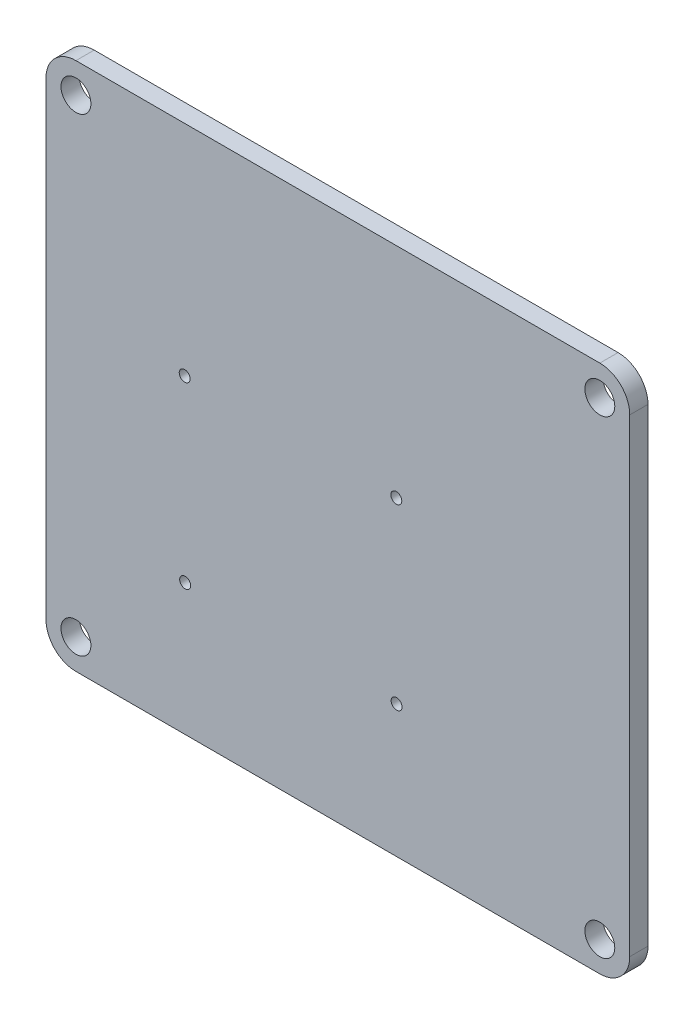
ISO-10303-21;
HEADER;
FILE_DESCRIPTION(('STEP AP214'),'2;1');
FILE_NAME('part.step','',(''),(''),'','','');
FILE_SCHEMA(('AUTOMOTIVE_DESIGN { 1 0 10303 214 1 1 1 1 }'));
ENDSEC;
DATA;
#1=APPLICATION_CONTEXT('core data for automotive mechanical design processes');
#2=APPLICATION_PROTOCOL_DEFINITION('international standard','automotive_design',2000,#1);
#3=PRODUCT_CONTEXT('',#1,'mechanical');
#4=PRODUCT('Part','Part','',(#3));
#5=PRODUCT_RELATED_PRODUCT_CATEGORY('part','',(#4));
#6=PRODUCT_DEFINITION_FORMATION('','',#4);
#7=PRODUCT_DEFINITION_CONTEXT('part definition',#1,'design');
#8=PRODUCT_DEFINITION('design','',#6,#7);
#9=PRODUCT_DEFINITION_SHAPE('','',#8);
#10=(LENGTH_UNIT() NAMED_UNIT(*) SI_UNIT(.MILLI.,.METRE.));
#11=(NAMED_UNIT(*) PLANE_ANGLE_UNIT() SI_UNIT($,.RADIAN.));
#12=(NAMED_UNIT(*) SI_UNIT($,.STERADIAN.) SOLID_ANGLE_UNIT());
#13=UNCERTAINTY_MEASURE_WITH_UNIT(LENGTH_MEASURE(1.E-05),#10,'distance_accuracy_value','');
#14=(GEOMETRIC_REPRESENTATION_CONTEXT(3) GLOBAL_UNCERTAINTY_ASSIGNED_CONTEXT((#13)) GLOBAL_UNIT_ASSIGNED_CONTEXT((#10,
#11,#12)) REPRESENTATION_CONTEXT('',''));
#15=CARTESIAN_POINT('',(0.,0.,0.));
#16=DIRECTION('',(0.,0.,1.));
#17=DIRECTION('',(1.,0.,0.));
#18=AXIS2_PLACEMENT_3D('',#15,#16,#17);
#19=CARTESIAN_POINT('',(-71.8,-64.3,5.));
#20=DIRECTION('',(0.,0.,-1.));
#21=DIRECTION('',(-1.,0.,0.));
#22=AXIS2_PLACEMENT_3D('',#19,#20,#21);
#23=CYLINDRICAL_SURFACE('',#22,8.19999999999999);
#24=CARTESIAN_POINT('',(-71.8,-64.3,0.));
#25=DIRECTION('',(0.,0.,1.));
#26=DIRECTION('',(1.,0.,0.));
#27=AXIS2_PLACEMENT_3D('',#24,#25,#26);
#28=CIRCLE('',#27,8.19999999999999);
#29=CARTESIAN_POINT('',(-71.8,-72.5,0.));
#30=VERTEX_POINT('',#29);
#31=CARTESIAN_POINT('',(-80.,-64.3,0.));
#32=VERTEX_POINT('',#31);
#33=EDGE_CURVE('E149',#30,#32,#28,.F.);
#34=ORIENTED_EDGE('',*,*,#33,.F.);
#35=DIRECTION('',(0.,0.,-1.));
#36=VECTOR('',#35,1.);
#37=CARTESIAN_POINT('',(-71.8,-72.5,5.));
#38=LINE('',#37,#36);
#39=CARTESIAN_POINT('',(-71.8,-72.5,5.));
#40=VERTEX_POINT('',#39);
#41=EDGE_CURVE('E11',#40,#30,#38,.T.);
#42=ORIENTED_EDGE('',*,*,#41,.F.);
#43=CARTESIAN_POINT('',(-71.8,-64.3,5.));
#44=DIRECTION('',(0.,0.,1.));
#45=DIRECTION('',(1.,0.,0.));
#46=AXIS2_PLACEMENT_3D('',#43,#44,#45);
#47=CIRCLE('',#46,8.19999999999999);
#48=CARTESIAN_POINT('',(-80.,-64.3,5.));
#49=VERTEX_POINT('',#48);
#50=EDGE_CURVE('E284',#40,#49,#47,.F.);
#51=ORIENTED_EDGE('',*,*,#50,.T.);
#52=DIRECTION('',(0.,0.,-1.));
#53=VECTOR('',#52,1.);
#54=CARTESIAN_POINT('',(-80.,-64.3,5.));
#55=LINE('',#54,#53);
#56=EDGE_CURVE('E58',#49,#32,#55,.T.);
#57=ORIENTED_EDGE('',*,*,#56,.T.);
#58=EDGE_LOOP('',(#34,#42,#51,#57));
#59=FACE_BOUND('',#58,.T.);
#60=ADVANCED_FACE('F41',(#59),#23,.T.);
#61=CARTESIAN_POINT('',(0.,-72.5,5.));
#62=DIRECTION('',(0.,-1.,0.));
#63=DIRECTION('',(0.,0.,-1.));
#64=AXIS2_PLACEMENT_3D('',#61,#62,#63);
#65=PLANE('',#64);
#66=DIRECTION('',(-1.,0.,0.));
#67=VECTOR('',#66,1.);
#68=CARTESIAN_POINT('',(0.,-72.5,0.));
#69=LINE('',#68,#67);
#70=CARTESIAN_POINT('',(71.8,-72.5,0.));
#71=VERTEX_POINT('',#70);
#72=EDGE_CURVE('E148',#71,#30,#69,.T.);
#73=ORIENTED_EDGE('',*,*,#72,.F.);
#74=DIRECTION('',(0.,0.,-1.));
#75=VECTOR('',#74,1.);
#76=CARTESIAN_POINT('',(71.8,-72.5,5.));
#77=LINE('',#76,#75);
#78=CARTESIAN_POINT('',(71.8,-72.5,5.));
#79=VERTEX_POINT('',#78);
#80=EDGE_CURVE('E51',#79,#71,#77,.T.);
#81=ORIENTED_EDGE('',*,*,#80,.F.);
#82=DIRECTION('',(-1.,0.,0.));
#83=VECTOR('',#82,1.);
#84=CARTESIAN_POINT('',(0.,-72.5,5.));
#85=LINE('',#84,#83);
#86=EDGE_CURVE('E282',#79,#40,#85,.T.);
#87=ORIENTED_EDGE('',*,*,#86,.T.);
#88=ORIENTED_EDGE('',*,*,#41,.T.);
#89=EDGE_LOOP('',(#73,#81,#87,#88));
#90=FACE_BOUND('',#89,.T.);
#91=ADVANCED_FACE('F210',(#90),#65,.T.);
#92=CARTESIAN_POINT('',(71.8,-64.3,5.));
#93=DIRECTION('',(0.,0.,-1.));
#94=DIRECTION('',(-1.,0.,0.));
#95=AXIS2_PLACEMENT_3D('',#92,#93,#94);
#96=CYLINDRICAL_SURFACE('',#95,8.19999999999999);
#97=CARTESIAN_POINT('',(71.8,-64.3,0.));
#98=DIRECTION('',(0.,0.,1.));
#99=DIRECTION('',(1.,0.,0.));
#100=AXIS2_PLACEMENT_3D('',#97,#98,#99);
#101=CIRCLE('',#100,8.19999999999999);
#102=CARTESIAN_POINT('',(80.,-64.3,0.));
#103=VERTEX_POINT('',#102);
#104=EDGE_CURVE('E154',#103,#71,#101,.F.);
#105=ORIENTED_EDGE('',*,*,#104,.F.);
#106=DIRECTION('',(0.,0.,-1.));
#107=VECTOR('',#106,1.);
#108=CARTESIAN_POINT('',(80.,-64.3,5.));
#109=LINE('',#108,#107);
#110=CARTESIAN_POINT('',(80.,-64.3,5.));
#111=VERTEX_POINT('',#110);
#112=EDGE_CURVE('E174',#111,#103,#109,.T.);
#113=ORIENTED_EDGE('',*,*,#112,.F.);
#114=CARTESIAN_POINT('',(71.8,-64.3,5.));
#115=DIRECTION('',(0.,0.,1.));
#116=DIRECTION('',(1.,0.,0.));
#117=AXIS2_PLACEMENT_3D('',#114,#115,#116);
#118=CIRCLE('',#117,8.19999999999999);
#119=EDGE_CURVE('E280',#111,#79,#118,.F.);
#120=ORIENTED_EDGE('',*,*,#119,.T.);
#121=ORIENTED_EDGE('',*,*,#80,.T.);
#122=EDGE_LOOP('',(#105,#113,#120,#121));
#123=FACE_BOUND('',#122,.T.);
#124=ADVANCED_FACE('F215',(#123),#96,.T.);
#125=CARTESIAN_POINT('',(80.,0.,5.));
#126=DIRECTION('',(-1.,0.,0.));
#127=DIRECTION('',(0.,0.,1.));
#128=AXIS2_PLACEMENT_3D('',#125,#126,#127);
#129=PLANE('',#128);
#130=DIRECTION('',(0.,1.,0.));
#131=VECTOR('',#130,1.);
#132=CARTESIAN_POINT('',(80.,0.,0.));
#133=LINE('',#132,#131);
#134=CARTESIAN_POINT('',(80.,64.3,0.));
#135=VERTEX_POINT('',#134);
#136=EDGE_CURVE('E157',#103,#135,#133,.T.);
#137=ORIENTED_EDGE('',*,*,#136,.T.);
#138=DIRECTION('',(0.,0.,-1.));
#139=VECTOR('',#138,1.);
#140=CARTESIAN_POINT('',(80.,64.3,5.));
#141=LINE('',#140,#139);
#142=CARTESIAN_POINT('',(80.,64.3,5.));
#143=VERTEX_POINT('',#142);
#144=EDGE_CURVE('E175',#143,#135,#141,.T.);
#145=ORIENTED_EDGE('',*,*,#144,.F.);
#146=DIRECTION('',(0.,1.,0.));
#147=VECTOR('',#146,1.);
#148=CARTESIAN_POINT('',(80.,0.,5.));
#149=LINE('',#148,#147);
#150=EDGE_CURVE('E273',#111,#143,#149,.T.);
#151=ORIENTED_EDGE('',*,*,#150,.F.);
#152=ORIENTED_EDGE('',*,*,#112,.T.);
#153=EDGE_LOOP('',(#137,#145,#151,#152));
#154=FACE_BOUND('',#153,.T.);
#155=ADVANCED_FACE('F265',(#154),#129,.F.);
#156=CARTESIAN_POINT('',(71.8,64.3,5.));
#157=DIRECTION('',(0.,0.,-1.));
#158=DIRECTION('',(-1.,0.,0.));
#159=AXIS2_PLACEMENT_3D('',#156,#157,#158);
#160=CYLINDRICAL_SURFACE('',#159,8.19999999999999);
#161=CARTESIAN_POINT('',(71.8,64.3,0.));
#162=DIRECTION('',(0.,0.,1.));
#163=DIRECTION('',(1.,0.,0.));
#164=AXIS2_PLACEMENT_3D('',#161,#162,#163);
#165=CIRCLE('',#164,8.19999999999999);
#166=CARTESIAN_POINT('',(71.8,72.5,0.));
#167=VERTEX_POINT('',#166);
#168=EDGE_CURVE('E156',#135,#167,#165,.T.);
#169=ORIENTED_EDGE('',*,*,#168,.T.);
#170=DIRECTION('',(0.,0.,-1.));
#171=VECTOR('',#170,1.);
#172=CARTESIAN_POINT('',(71.8,72.5,5.));
#173=LINE('',#172,#171);
#174=CARTESIAN_POINT('',(71.8,72.5,5.));
#175=VERTEX_POINT('',#174);
#176=EDGE_CURVE('E129',#175,#167,#173,.T.);
#177=ORIENTED_EDGE('',*,*,#176,.F.);
#178=CARTESIAN_POINT('',(71.8,64.3,5.));
#179=DIRECTION('',(0.,0.,1.));
#180=DIRECTION('',(1.,0.,0.));
#181=AXIS2_PLACEMENT_3D('',#178,#179,#180);
#182=CIRCLE('',#181,8.19999999999999);
#183=EDGE_CURVE('E120',#143,#175,#182,.T.);
#184=ORIENTED_EDGE('',*,*,#183,.F.);
#185=ORIENTED_EDGE('',*,*,#144,.T.);
#186=EDGE_LOOP('',(#169,#177,#184,#185));
#187=FACE_BOUND('',#186,.T.);
#188=ADVANCED_FACE('F256',(#187),#160,.T.);
#189=CARTESIAN_POINT('',(0.,72.5,5.));
#190=DIRECTION('',(0.,-1.,0.));
#191=DIRECTION('',(0.,0.,-1.));
#192=AXIS2_PLACEMENT_3D('',#189,#190,#191);
#193=PLANE('',#192);
#194=DIRECTION('',(-1.,0.,0.));
#195=VECTOR('',#194,1.);
#196=CARTESIAN_POINT('',(0.,72.5,0.));
#197=LINE('',#196,#195);
#198=CARTESIAN_POINT('',(-71.8,72.5,0.));
#199=VERTEX_POINT('',#198);
#200=EDGE_CURVE('E123',#167,#199,#197,.T.);
#201=ORIENTED_EDGE('',*,*,#200,.T.);
#202=DIRECTION('',(0.,0.,-1.));
#203=VECTOR('',#202,1.);
#204=CARTESIAN_POINT('',(-71.8,72.5,5.));
#205=LINE('',#204,#203);
#206=CARTESIAN_POINT('',(-71.8,72.5,5.));
#207=VERTEX_POINT('',#206);
#208=EDGE_CURVE('E124',#207,#199,#205,.T.);
#209=ORIENTED_EDGE('',*,*,#208,.F.);
#210=DIRECTION('',(-1.,0.,0.));
#211=VECTOR('',#210,1.);
#212=CARTESIAN_POINT('',(0.,72.5,5.));
#213=LINE('',#212,#211);
#214=EDGE_CURVE('E109',#175,#207,#213,.T.);
#215=ORIENTED_EDGE('',*,*,#214,.F.);
#216=ORIENTED_EDGE('',*,*,#176,.T.);
#217=EDGE_LOOP('',(#201,#209,#215,#216));
#218=FACE_BOUND('',#217,.T.);
#219=ADVANCED_FACE('F121',(#218),#193,.F.);
#220=CARTESIAN_POINT('',(-71.8,64.3,5.));
#221=DIRECTION('',(0.,0.,-1.));
#222=DIRECTION('',(-1.,0.,0.));
#223=AXIS2_PLACEMENT_3D('',#220,#221,#222);
#224=CYLINDRICAL_SURFACE('',#223,8.19999999999999);
#225=CARTESIAN_POINT('',(-71.8,64.3,0.));
#226=DIRECTION('',(0.,0.,1.));
#227=DIRECTION('',(1.,0.,0.));
#228=AXIS2_PLACEMENT_3D('',#225,#226,#227);
#229=CIRCLE('',#228,8.19999999999999);
#230=CARTESIAN_POINT('',(-80.,64.3,0.));
#231=VERTEX_POINT('',#230);
#232=EDGE_CURVE('E161',#231,#199,#229,.F.);
#233=ORIENTED_EDGE('',*,*,#232,.F.);
#234=DIRECTION('',(0.,0.,-1.));
#235=VECTOR('',#234,1.);
#236=CARTESIAN_POINT('',(-80.,64.3,5.));
#237=LINE('',#236,#235);
#238=CARTESIAN_POINT('',(-80.,64.3,5.));
#239=VERTEX_POINT('',#238);
#240=EDGE_CURVE('E83',#239,#231,#237,.T.);
#241=ORIENTED_EDGE('',*,*,#240,.F.);
#242=CARTESIAN_POINT('',(-71.8,64.3,5.));
#243=DIRECTION('',(0.,0.,1.));
#244=DIRECTION('',(1.,0.,0.));
#245=AXIS2_PLACEMENT_3D('',#242,#243,#244);
#246=CIRCLE('',#245,8.19999999999999);
#247=EDGE_CURVE('E114',#239,#207,#246,.F.);
#248=ORIENTED_EDGE('',*,*,#247,.T.);
#249=ORIENTED_EDGE('',*,*,#208,.T.);
#250=EDGE_LOOP('',(#233,#241,#248,#249));
#251=FACE_BOUND('',#250,.T.);
#252=ADVANCED_FACE('F128',(#251),#224,.T.);
#253=CARTESIAN_POINT('',(-71.8,-64.3,5.));
#254=DIRECTION('',(0.,0.,-1.));
#255=DIRECTION('',(-1.,0.,0.));
#256=AXIS2_PLACEMENT_3D('',#253,#254,#255);
#257=CYLINDRICAL_SURFACE('',#256,4.1);
#258=CARTESIAN_POINT('',(-71.8,-64.3,5.));
#259=DIRECTION('',(0.,0.,1.));
#260=DIRECTION('',(1.,0.,0.));
#261=AXIS2_PLACEMENT_3D('',#258,#259,#260);
#262=CIRCLE('',#261,4.1);
#263=CARTESIAN_POINT('',(-67.7,-64.3,5.));
#264=VERTEX_POINT('',#263);
#265=EDGE_CURVE('E290',#264,#264,#262,.T.);
#266=ORIENTED_EDGE('',*,*,#265,.T.);
#267=EDGE_LOOP('',(#266));
#268=FACE_BOUND('',#267,.T.);
#269=CARTESIAN_POINT('',(-71.8,-64.3,0.));
#270=DIRECTION('',(0.,0.,1.));
#271=DIRECTION('',(1.,0.,0.));
#272=AXIS2_PLACEMENT_3D('',#269,#270,#271);
#273=CIRCLE('',#272,4.1);
#274=CARTESIAN_POINT('',(-67.7,-64.3,0.));
#275=VERTEX_POINT('',#274);
#276=EDGE_CURVE('E143',#275,#275,#273,.T.);
#277=ORIENTED_EDGE('',*,*,#276,.F.);
#278=EDGE_LOOP('',(#277));
#279=FACE_BOUND('',#278,.T.);
#280=ADVANCED_FACE('F220',(#268,#279),#257,.F.);
#281=CARTESIAN_POINT('',(-71.8,64.3,5.));
#282=DIRECTION('',(0.,0.,-1.));
#283=DIRECTION('',(-1.,0.,0.));
#284=AXIS2_PLACEMENT_3D('',#281,#282,#283);
#285=CYLINDRICAL_SURFACE('',#284,4.1);
#286=CARTESIAN_POINT('',(-71.8,64.3,5.));
#287=DIRECTION('',(0.,0.,1.));
#288=DIRECTION('',(1.,0.,0.));
#289=AXIS2_PLACEMENT_3D('',#286,#287,#288);
#290=CIRCLE('',#289,4.1);
#291=CARTESIAN_POINT('',(-67.7,64.3,5.));
#292=VERTEX_POINT('',#291);
#293=EDGE_CURVE('E288',#292,#292,#290,.T.);
#294=ORIENTED_EDGE('',*,*,#293,.T.);
#295=EDGE_LOOP('',(#294));
#296=FACE_BOUND('',#295,.T.);
#297=CARTESIAN_POINT('',(-71.8,64.3,0.));
#298=DIRECTION('',(0.,0.,1.));
#299=DIRECTION('',(1.,0.,0.));
#300=AXIS2_PLACEMENT_3D('',#297,#298,#299);
#301=CIRCLE('',#300,4.1);
#302=CARTESIAN_POINT('',(-67.7,64.3,0.));
#303=VERTEX_POINT('',#302);
#304=EDGE_CURVE('E145',#303,#303,#301,.T.);
#305=ORIENTED_EDGE('',*,*,#304,.F.);
#306=EDGE_LOOP('',(#305));
#307=FACE_BOUND('',#306,.T.);
#308=ADVANCED_FACE('F218',(#296,#307),#285,.F.);
#309=CARTESIAN_POINT('',(71.8,64.3,5.));
#310=DIRECTION('',(0.,0.,-1.));
#311=DIRECTION('',(-1.,0.,0.));
#312=AXIS2_PLACEMENT_3D('',#309,#310,#311);
#313=CYLINDRICAL_SURFACE('',#312,4.1);
#314=CARTESIAN_POINT('',(71.8,64.3,5.));
#315=DIRECTION('',(0.,0.,1.));
#316=DIRECTION('',(1.,0.,0.));
#317=AXIS2_PLACEMENT_3D('',#314,#315,#316);
#318=CIRCLE('',#317,4.1);
#319=CARTESIAN_POINT('',(75.9,64.3,5.));
#320=VERTEX_POINT('',#319);
#321=EDGE_CURVE('E232',#320,#320,#318,.T.);
#322=ORIENTED_EDGE('',*,*,#321,.T.);
#323=EDGE_LOOP('',(#322));
#324=FACE_BOUND('',#323,.T.);
#325=CARTESIAN_POINT('',(71.8,64.3,0.));
#326=DIRECTION('',(0.,0.,1.));
#327=DIRECTION('',(1.,0.,0.));
#328=AXIS2_PLACEMENT_3D('',#325,#326,#327);
#329=CIRCLE('',#328,4.1);
#330=CARTESIAN_POINT('',(75.9,64.3,0.));
#331=VERTEX_POINT('',#330);
#332=EDGE_CURVE('E136',#331,#331,#329,.T.);
#333=ORIENTED_EDGE('',*,*,#332,.F.);
#334=EDGE_LOOP('',(#333));
#335=FACE_BOUND('',#334,.T.);
#336=ADVANCED_FACE('F224',(#324,#335),#313,.F.);
#337=CARTESIAN_POINT('',(71.8,-64.3,5.));
#338=DIRECTION('',(0.,0.,-1.));
#339=DIRECTION('',(-1.,0.,0.));
#340=AXIS2_PLACEMENT_3D('',#337,#338,#339);
#341=CYLINDRICAL_SURFACE('',#340,4.1);
#342=CARTESIAN_POINT('',(71.8,-64.3,5.));
#343=DIRECTION('',(0.,0.,1.));
#344=DIRECTION('',(1.,0.,0.));
#345=AXIS2_PLACEMENT_3D('',#342,#343,#344);
#346=CIRCLE('',#345,4.1);
#347=CARTESIAN_POINT('',(75.9,-64.3,5.));
#348=VERTEX_POINT('',#347);
#349=EDGE_CURVE('E166',#348,#348,#346,.T.);
#350=ORIENTED_EDGE('',*,*,#349,.T.);
#351=EDGE_LOOP('',(#350));
#352=FACE_BOUND('',#351,.T.);
#353=CARTESIAN_POINT('',(71.8,-64.3,0.));
#354=DIRECTION('',(0.,0.,1.));
#355=DIRECTION('',(1.,0.,0.));
#356=AXIS2_PLACEMENT_3D('',#353,#354,#355);
#357=CIRCLE('',#356,4.1);
#358=CARTESIAN_POINT('',(75.9,-64.3,0.));
#359=VERTEX_POINT('',#358);
#360=EDGE_CURVE('E137',#359,#359,#357,.T.);
#361=ORIENTED_EDGE('',*,*,#360,.F.);
#362=EDGE_LOOP('',(#361));
#363=FACE_BOUND('',#362,.T.);
#364=ADVANCED_FACE('F43',(#352,#363),#341,.F.);
#365=CARTESIAN_POINT('',(-80.,0.,5.));
#366=DIRECTION('',(-1.,0.,0.));
#367=DIRECTION('',(0.,0.,1.));
#368=AXIS2_PLACEMENT_3D('',#365,#366,#367);
#369=PLANE('',#368);
#370=DIRECTION('',(0.,1.,0.));
#371=VECTOR('',#370,1.);
#372=CARTESIAN_POINT('',(-80.,0.,0.));
#373=LINE('',#372,#371);
#374=EDGE_CURVE('E164',#32,#231,#373,.T.);
#375=ORIENTED_EDGE('',*,*,#374,.F.);
#376=ORIENTED_EDGE('',*,*,#56,.F.);
#377=DIRECTION('',(0.,1.,0.));
#378=VECTOR('',#377,1.);
#379=CARTESIAN_POINT('',(-80.,0.,5.));
#380=LINE('',#379,#378);
#381=EDGE_CURVE('E132',#49,#239,#380,.T.);
#382=ORIENTED_EDGE('',*,*,#381,.T.);
#383=ORIENTED_EDGE('',*,*,#240,.T.);
#384=EDGE_LOOP('',(#375,#376,#382,#383));
#385=FACE_BOUND('',#384,.T.);
#386=ADVANCED_FACE('F229',(#385),#369,.T.);
#387=CARTESIAN_POINT('',(0.,0.,5.));
#388=DIRECTION('',(0.,0.,1.));
#389=DIRECTION('',(1.,0.,0.));
#390=AXIS2_PLACEMENT_3D('',#387,#388,#389);
#391=PLANE('',#390);
#392=CARTESIAN_POINT('',(-41.863805611608,-36.4266556526666,5.));
#393=DIRECTION('',(0.,0.,1.));
#394=DIRECTION('',(1.,0.,0.));
#395=AXIS2_PLACEMENT_3D('',#392,#393,#394);
#396=CIRCLE('',#395,1.5);
#397=CARTESIAN_POINT('',(-40.363805611608,-36.4266556526666,5.));
#398=VERTEX_POINT('',#397);
#399=EDGE_CURVE('E299',#398,#398,#396,.T.);
#400=ORIENTED_EDGE('',*,*,#399,.F.);
#401=EDGE_LOOP('',(#400));
#402=FACE_BOUND('',#401,.T.);
#403=CARTESIAN_POINT('',(16.0858742720141,-36.2415182747968,5.));
#404=DIRECTION('',(0.,0.,1.));
#405=DIRECTION('',(1.,0.,0.));
#406=AXIS2_PLACEMENT_3D('',#403,#404,#405);
#407=CIRCLE('',#406,1.5);
#408=CARTESIAN_POINT('',(17.5858742720141,-36.2415182747968,5.));
#409=VERTEX_POINT('',#408);
#410=EDGE_CURVE('E301',#409,#409,#407,.T.);
#411=ORIENTED_EDGE('',*,*,#410,.F.);
#412=EDGE_LOOP('',(#411));
#413=FACE_BOUND('',#412,.T.);
#414=CARTESIAN_POINT('',(16.0134378967766,12.6184993730969,5.));
#415=DIRECTION('',(0.,0.,1.));
#416=DIRECTION('',(1.,0.,0.));
#417=AXIS2_PLACEMENT_3D('',#414,#415,#416);
#418=CIRCLE('',#417,1.5);
#419=CARTESIAN_POINT('',(17.5134378967766,12.6184993730969,5.));
#420=VERTEX_POINT('',#419);
#421=EDGE_CURVE('E296',#420,#420,#418,.T.);
#422=ORIENTED_EDGE('',*,*,#421,.F.);
#423=EDGE_LOOP('',(#422));
#424=FACE_BOUND('',#423,.T.);
#425=CARTESIAN_POINT('',(-41.9866307440674,12.5731904081818,5.));
#426=DIRECTION('',(0.,0.,1.));
#427=DIRECTION('',(1.,0.,0.));
#428=AXIS2_PLACEMENT_3D('',#425,#426,#427);
#429=CIRCLE('',#428,1.5);
#430=CARTESIAN_POINT('',(-40.4866307440674,12.5731904081818,5.));
#431=VERTEX_POINT('',#430);
#432=EDGE_CURVE('E185',#431,#431,#429,.T.);
#433=ORIENTED_EDGE('',*,*,#432,.F.);
#434=EDGE_LOOP('',(#433));
#435=FACE_BOUND('',#434,.T.);
#436=ORIENTED_EDGE('',*,*,#349,.F.);
#437=EDGE_LOOP('',(#436));
#438=FACE_BOUND('',#437,.T.);
#439=ORIENTED_EDGE('',*,*,#321,.F.);
#440=EDGE_LOOP('',(#439));
#441=FACE_BOUND('',#440,.T.);
#442=ORIENTED_EDGE('',*,*,#293,.F.);
#443=EDGE_LOOP('',(#442));
#444=FACE_BOUND('',#443,.T.);
#445=ORIENTED_EDGE('',*,*,#265,.F.);
#446=EDGE_LOOP('',(#445));
#447=FACE_BOUND('',#446,.T.);
#448=ORIENTED_EDGE('',*,*,#50,.F.);
#449=ORIENTED_EDGE('',*,*,#86,.F.);
#450=ORIENTED_EDGE('',*,*,#119,.F.);
#451=ORIENTED_EDGE('',*,*,#150,.T.);
#452=ORIENTED_EDGE('',*,*,#183,.T.);
#453=ORIENTED_EDGE('',*,*,#214,.T.);
#454=ORIENTED_EDGE('',*,*,#247,.F.);
#455=ORIENTED_EDGE('',*,*,#381,.F.);
#456=EDGE_LOOP('',(#448,#449,#450,#451,#452,#453,#454,#455));
#457=FACE_BOUND('',#456,.T.);
#458=ADVANCED_FACE('F115',(#402,#413,#424,#435,#438,#441,#444,#447,#457),#391,.T.);
#459=CARTESIAN_POINT('',(0.,0.,0.));
#460=DIRECTION('',(0.,0.,1.));
#461=DIRECTION('',(1.,0.,0.));
#462=AXIS2_PLACEMENT_3D('',#459,#460,#461);
#463=PLANE('',#462);
#464=CARTESIAN_POINT('',(-41.863805611608,-36.4266556526666,0.));
#465=DIRECTION('',(0.,0.,1.));
#466=DIRECTION('',(1.,0.,0.));
#467=AXIS2_PLACEMENT_3D('',#464,#465,#466);
#468=CIRCLE('',#467,1.5);
#469=CARTESIAN_POINT('',(-40.363805611608,-36.4266556526666,0.));
#470=VERTEX_POINT('',#469);
#471=EDGE_CURVE('E44',#470,#470,#468,.T.);
#472=ORIENTED_EDGE('',*,*,#471,.T.);
#473=EDGE_LOOP('',(#472));
#474=FACE_BOUND('',#473,.T.);
#475=CARTESIAN_POINT('',(16.0858742720141,-36.2415182747968,0.));
#476=DIRECTION('',(0.,0.,1.));
#477=DIRECTION('',(1.,0.,0.));
#478=AXIS2_PLACEMENT_3D('',#475,#476,#477);
#479=CIRCLE('',#478,1.5);
#480=CARTESIAN_POINT('',(17.5858742720141,-36.2415182747968,0.));
#481=VERTEX_POINT('',#480);
#482=EDGE_CURVE('E183',#481,#481,#479,.T.);
#483=ORIENTED_EDGE('',*,*,#482,.T.);
#484=EDGE_LOOP('',(#483));
#485=FACE_BOUND('',#484,.T.);
#486=CARTESIAN_POINT('',(16.0134378967766,12.6184993730969,0.));
#487=DIRECTION('',(0.,0.,1.));
#488=DIRECTION('',(1.,0.,0.));
#489=AXIS2_PLACEMENT_3D('',#486,#487,#488);
#490=CIRCLE('',#489,1.5);
#491=CARTESIAN_POINT('',(17.5134378967766,12.6184993730969,0.));
#492=VERTEX_POINT('',#491);
#493=EDGE_CURVE('E181',#492,#492,#490,.T.);
#494=ORIENTED_EDGE('',*,*,#493,.T.);
#495=EDGE_LOOP('',(#494));
#496=FACE_BOUND('',#495,.T.);
#497=CARTESIAN_POINT('',(-41.9866307440674,12.5731904081818,0.));
#498=DIRECTION('',(0.,0.,1.));
#499=DIRECTION('',(1.,0.,0.));
#500=AXIS2_PLACEMENT_3D('',#497,#498,#499);
#501=CIRCLE('',#500,1.5);
#502=CARTESIAN_POINT('',(-40.4866307440674,12.5731904081818,0.));
#503=VERTEX_POINT('',#502);
#504=EDGE_CURVE('E178',#503,#503,#501,.T.);
#505=ORIENTED_EDGE('',*,*,#504,.T.);
#506=EDGE_LOOP('',(#505));
#507=FACE_BOUND('',#506,.T.);
#508=ORIENTED_EDGE('',*,*,#360,.T.);
#509=EDGE_LOOP('',(#508));
#510=FACE_BOUND('',#509,.T.);
#511=ORIENTED_EDGE('',*,*,#332,.T.);
#512=EDGE_LOOP('',(#511));
#513=FACE_BOUND('',#512,.T.);
#514=ORIENTED_EDGE('',*,*,#304,.T.);
#515=EDGE_LOOP('',(#514));
#516=FACE_BOUND('',#515,.T.);
#517=ORIENTED_EDGE('',*,*,#276,.T.);
#518=EDGE_LOOP('',(#517));
#519=FACE_BOUND('',#518,.T.);
#520=ORIENTED_EDGE('',*,*,#33,.T.);
#521=ORIENTED_EDGE('',*,*,#374,.T.);
#522=ORIENTED_EDGE('',*,*,#232,.T.);
#523=ORIENTED_EDGE('',*,*,#200,.F.);
#524=ORIENTED_EDGE('',*,*,#168,.F.);
#525=ORIENTED_EDGE('',*,*,#136,.F.);
#526=ORIENTED_EDGE('',*,*,#104,.T.);
#527=ORIENTED_EDGE('',*,*,#72,.T.);
#528=EDGE_LOOP('',(#520,#521,#522,#523,#524,#525,#526,#527));
#529=FACE_BOUND('',#528,.T.);
#530=ADVANCED_FACE('F192',(#474,#485,#496,#507,#510,#513,#516,#519,#529),#463,.F.);
#531=CARTESIAN_POINT('',(-41.9866307440674,12.5731904081818,-5.));
#532=DIRECTION('',(0.,0.,1.));
#533=DIRECTION('',(1.,0.,0.));
#534=AXIS2_PLACEMENT_3D('',#531,#532,#533);
#535=CYLINDRICAL_SURFACE('',#534,1.5);
#536=ORIENTED_EDGE('',*,*,#432,.T.);
#537=EDGE_LOOP('',(#536));
#538=FACE_BOUND('',#537,.T.);
#539=ORIENTED_EDGE('',*,*,#504,.F.);
#540=EDGE_LOOP('',(#539));
#541=FACE_BOUND('',#540,.T.);
#542=ADVANCED_FACE('F239',(#538,#541),#535,.F.);
#543=CARTESIAN_POINT('',(16.0134378967766,12.6184993730969,-5.));
#544=DIRECTION('',(0.,0.,1.));
#545=DIRECTION('',(1.,0.,0.));
#546=AXIS2_PLACEMENT_3D('',#543,#544,#545);
#547=CYLINDRICAL_SURFACE('',#546,1.5);
#548=ORIENTED_EDGE('',*,*,#421,.T.);
#549=EDGE_LOOP('',(#548));
#550=FACE_BOUND('',#549,.T.);
#551=ORIENTED_EDGE('',*,*,#493,.F.);
#552=EDGE_LOOP('',(#551));
#553=FACE_BOUND('',#552,.T.);
#554=ADVANCED_FACE('F202',(#550,#553),#547,.F.);
#555=CARTESIAN_POINT('',(16.0858742720141,-36.2415182747968,-5.));
#556=DIRECTION('',(0.,0.,1.));
#557=DIRECTION('',(1.,0.,0.));
#558=AXIS2_PLACEMENT_3D('',#555,#556,#557);
#559=CYLINDRICAL_SURFACE('',#558,1.5);
#560=ORIENTED_EDGE('',*,*,#410,.T.);
#561=EDGE_LOOP('',(#560));
#562=FACE_BOUND('',#561,.T.);
#563=ORIENTED_EDGE('',*,*,#482,.F.);
#564=EDGE_LOOP('',(#563));
#565=FACE_BOUND('',#564,.T.);
#566=ADVANCED_FACE('F193',(#562,#565),#559,.F.);
#567=CARTESIAN_POINT('',(-41.863805611608,-36.4266556526666,-5.));
#568=DIRECTION('',(0.,0.,1.));
#569=DIRECTION('',(1.,0.,0.));
#570=AXIS2_PLACEMENT_3D('',#567,#568,#569);
#571=CYLINDRICAL_SURFACE('',#570,1.5);
#572=ORIENTED_EDGE('',*,*,#399,.T.);
#573=EDGE_LOOP('',(#572));
#574=FACE_BOUND('',#573,.T.);
#575=ORIENTED_EDGE('',*,*,#471,.F.);
#576=EDGE_LOOP('',(#575));
#577=FACE_BOUND('',#576,.T.);
#578=ADVANCED_FACE('F194',(#574,#577),#571,.F.);
#579=CLOSED_SHELL('',(#60,#91,#124,#155,#188,#219,#252,#280,#308,#336,#364,#386,#458,#530,#542,
#554,#566,#578));
#580=MANIFOLD_SOLID_BREP('B2',#579);
#581=ADVANCED_BREP_SHAPE_REPRESENTATION('',(#18,#580),#14);
#582=SHAPE_DEFINITION_REPRESENTATION(#9,#581);
ENDSEC;
END-ISO-10303-21;
